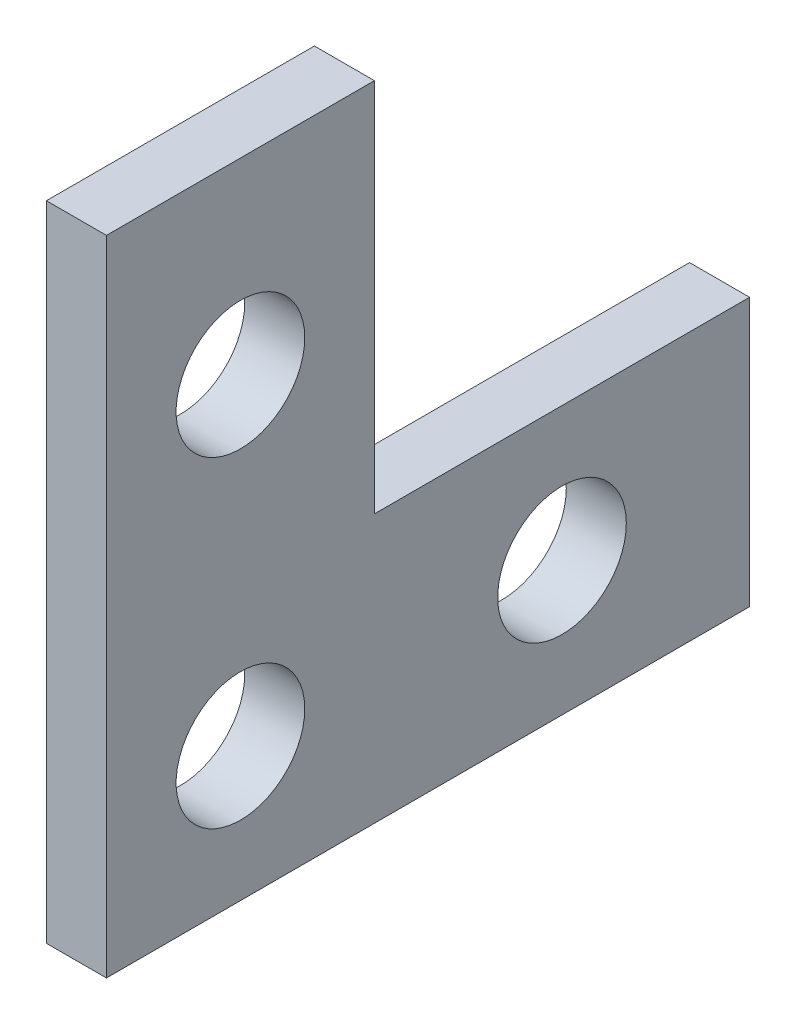
ISO-10303-21;
HEADER;
FILE_DESCRIPTION(('STEP AP214'),'2;1');
FILE_NAME('part.step','',(''),(''),'','','');
FILE_SCHEMA(('AUTOMOTIVE_DESIGN { 1 0 10303 214 1 1 1 1 }'));
ENDSEC;
DATA;
#1=APPLICATION_CONTEXT('core data for automotive mechanical design processes');
#2=APPLICATION_PROTOCOL_DEFINITION('international standard','automotive_design',2000,#1);
#3=PRODUCT_CONTEXT('',#1,'mechanical');
#4=PRODUCT('Part','Part','',(#3));
#5=PRODUCT_RELATED_PRODUCT_CATEGORY('part','',(#4));
#6=PRODUCT_DEFINITION_FORMATION('','',#4);
#7=PRODUCT_DEFINITION_CONTEXT('part definition',#1,'design');
#8=PRODUCT_DEFINITION('design','',#6,#7);
#9=PRODUCT_DEFINITION_SHAPE('','',#8);
#10=(LENGTH_UNIT() NAMED_UNIT(*) SI_UNIT(.MILLI.,.METRE.));
#11=(NAMED_UNIT(*) PLANE_ANGLE_UNIT() SI_UNIT($,.RADIAN.));
#12=(NAMED_UNIT(*) SI_UNIT($,.STERADIAN.) SOLID_ANGLE_UNIT());
#13=UNCERTAINTY_MEASURE_WITH_UNIT(LENGTH_MEASURE(1.E-05),#10,'distance_accuracy_value','');
#14=(GEOMETRIC_REPRESENTATION_CONTEXT(3) GLOBAL_UNCERTAINTY_ASSIGNED_CONTEXT((#13)) GLOBAL_UNIT_ASSIGNED_CONTEXT((#10,
#11,#12)) REPRESENTATION_CONTEXT('',''));
#15=CARTESIAN_POINT('',(0.,0.,0.));
#16=DIRECTION('',(0.,0.,1.));
#17=DIRECTION('',(1.,0.,0.));
#18=AXIS2_PLACEMENT_3D('',#15,#16,#17);
#19=CARTESIAN_POINT('',(0.7,-7.49999999999999,-7.50000000000001));
#20=DIRECTION('',(0.,0.,1.));
#21=DIRECTION('',(0.,-1.,0.));
#22=AXIS2_PLACEMENT_3D('',#19,#20,#21);
#23=PLANE('',#22);
#24=DIRECTION('',(0.,1.,0.));
#25=VECTOR('',#24,1.);
#26=CARTESIAN_POINT('',(-0.7,-7.49999999999999,-7.50000000000001));
#27=LINE('',#26,#25);
#28=CARTESIAN_POINT('',(-0.7,-7.49999999999999,-7.50000000000001));
#29=VERTEX_POINT('',#28);
#30=CARTESIAN_POINT('',(-0.7,-1.24999999999999,-7.5));
#31=VERTEX_POINT('',#30);
#32=EDGE_CURVE('E118',#29,#31,#27,.T.);
#33=ORIENTED_EDGE('',*,*,#32,.T.);
#34=DIRECTION('',(-1.,0.,0.));
#35=VECTOR('',#34,1.);
#36=CARTESIAN_POINT('',(0.7,-1.24999999999999,-7.5));
#37=LINE('',#36,#35);
#38=CARTESIAN_POINT('',(0.7,-1.24999999999999,-7.5));
#39=VERTEX_POINT('',#38);
#40=EDGE_CURVE('E11',#39,#31,#37,.T.);
#41=ORIENTED_EDGE('',*,*,#40,.F.);
#42=DIRECTION('',(0.,1.,0.));
#43=VECTOR('',#42,1.);
#44=CARTESIAN_POINT('',(0.7,-7.49999999999999,-7.50000000000001));
#45=LINE('',#44,#43);
#46=CARTESIAN_POINT('',(0.7,-7.49999999999999,-7.50000000000001));
#47=VERTEX_POINT('',#46);
#48=EDGE_CURVE('E129',#47,#39,#45,.T.);
#49=ORIENTED_EDGE('',*,*,#48,.F.);
#50=DIRECTION('',(-1.,0.,0.));
#51=VECTOR('',#50,1.);
#52=CARTESIAN_POINT('',(0.7,-7.49999999999999,-7.50000000000001));
#53=LINE('',#52,#51);
#54=EDGE_CURVE('E114',#47,#29,#53,.T.);
#55=ORIENTED_EDGE('',*,*,#54,.T.);
#56=EDGE_LOOP('',(#33,#41,#49,#55));
#57=FACE_BOUND('',#56,.T.);
#58=ADVANCED_FACE('F32',(#57),#23,.F.);
#59=CARTESIAN_POINT('',(0.7,-1.24999999999999,-7.5));
#60=DIRECTION('',(0.,-1.,0.));
#61=DIRECTION('',(0.,0.,-1.));
#62=AXIS2_PLACEMENT_3D('',#59,#60,#61);
#63=PLANE('',#62);
#64=DIRECTION('',(0.,0.,1.));
#65=VECTOR('',#64,1.);
#66=CARTESIAN_POINT('',(-0.7,-1.24999999999999,-7.5));
#67=LINE('',#66,#65);
#68=CARTESIAN_POINT('',(-0.7,-1.24999999999999,1.24999999999999));
#69=VERTEX_POINT('',#68);
#70=EDGE_CURVE('E121',#31,#69,#67,.T.);
#71=ORIENTED_EDGE('',*,*,#70,.T.);
#72=DIRECTION('',(-1.,0.,0.));
#73=VECTOR('',#72,1.);
#74=CARTESIAN_POINT('',(0.7,-1.24999999999999,1.24999999999999));
#75=LINE('',#74,#73);
#76=CARTESIAN_POINT('',(0.7,-1.24999999999999,1.24999999999999));
#77=VERTEX_POINT('',#76);
#78=EDGE_CURVE('E41',#77,#69,#75,.T.);
#79=ORIENTED_EDGE('',*,*,#78,.F.);
#80=DIRECTION('',(0.,0.,1.));
#81=VECTOR('',#80,1.);
#82=CARTESIAN_POINT('',(0.7,-1.24999999999999,-7.5));
#83=LINE('',#82,#81);
#84=EDGE_CURVE('E87',#39,#77,#83,.T.);
#85=ORIENTED_EDGE('',*,*,#84,.F.);
#86=ORIENTED_EDGE('',*,*,#40,.T.);
#87=EDGE_LOOP('',(#71,#79,#85,#86));
#88=FACE_BOUND('',#87,.T.);
#89=ADVANCED_FACE('F156',(#88),#63,.F.);
#90=CARTESIAN_POINT('',(0.7,7.5,1.24999999999999));
#91=DIRECTION('',(0.,0.,1.));
#92=DIRECTION('',(0.,-1.,0.));
#93=AXIS2_PLACEMENT_3D('',#90,#91,#92);
#94=PLANE('',#93);
#95=DIRECTION('',(0.,1.,0.));
#96=VECTOR('',#95,1.);
#97=CARTESIAN_POINT('',(-0.7,7.5,1.24999999999999));
#98=LINE('',#97,#96);
#99=CARTESIAN_POINT('',(-0.7,7.5,1.24999999999999));
#100=VERTEX_POINT('',#99);
#101=EDGE_CURVE('E124',#69,#100,#98,.T.);
#102=ORIENTED_EDGE('',*,*,#101,.T.);
#103=DIRECTION('',(-1.,0.,0.));
#104=VECTOR('',#103,1.);
#105=CARTESIAN_POINT('',(0.7,7.5,1.24999999999999));
#106=LINE('',#105,#104);
#107=CARTESIAN_POINT('',(0.7,7.5,1.24999999999999));
#108=VERTEX_POINT('',#107);
#109=EDGE_CURVE('E109',#108,#100,#106,.T.);
#110=ORIENTED_EDGE('',*,*,#109,.F.);
#111=DIRECTION('',(0.,1.,0.));
#112=VECTOR('',#111,1.);
#113=CARTESIAN_POINT('',(0.7,7.5,1.24999999999999));
#114=LINE('',#113,#112);
#115=EDGE_CURVE('E100',#77,#108,#114,.T.);
#116=ORIENTED_EDGE('',*,*,#115,.F.);
#117=ORIENTED_EDGE('',*,*,#78,.T.);
#118=EDGE_LOOP('',(#102,#110,#116,#117));
#119=FACE_BOUND('',#118,.T.);
#120=ADVANCED_FACE('F159',(#119),#94,.F.);
#121=CARTESIAN_POINT('',(0.7,7.5,7.49999999999999));
#122=DIRECTION('',(0.,-1.,0.));
#123=DIRECTION('',(0.,0.,-1.));
#124=AXIS2_PLACEMENT_3D('',#121,#122,#123);
#125=PLANE('',#124);
#126=DIRECTION('',(0.,0.,1.));
#127=VECTOR('',#126,1.);
#128=CARTESIAN_POINT('',(-0.7,7.5,7.49999999999999));
#129=LINE('',#128,#127);
#130=CARTESIAN_POINT('',(-0.7,7.5,7.49999999999999));
#131=VERTEX_POINT('',#130);
#132=EDGE_CURVE('E108',#100,#131,#129,.T.);
#133=ORIENTED_EDGE('',*,*,#132,.T.);
#134=DIRECTION('',(-1.,0.,0.));
#135=VECTOR('',#134,1.);
#136=CARTESIAN_POINT('',(0.7,7.5,7.49999999999999));
#137=LINE('',#136,#135);
#138=CARTESIAN_POINT('',(0.7,7.5,7.49999999999999));
#139=VERTEX_POINT('',#138);
#140=EDGE_CURVE('E105',#139,#131,#137,.T.);
#141=ORIENTED_EDGE('',*,*,#140,.F.);
#142=DIRECTION('',(0.,0.,1.));
#143=VECTOR('',#142,1.);
#144=CARTESIAN_POINT('',(0.7,7.5,7.49999999999999));
#145=LINE('',#144,#143);
#146=EDGE_CURVE('E94',#108,#139,#145,.T.);
#147=ORIENTED_EDGE('',*,*,#146,.F.);
#148=ORIENTED_EDGE('',*,*,#109,.T.);
#149=EDGE_LOOP('',(#133,#141,#147,#148));
#150=FACE_BOUND('',#149,.T.);
#151=ADVANCED_FACE('F106',(#150),#125,.F.);
#152=CARTESIAN_POINT('',(0.7,7.5,7.49999999999999));
#153=DIRECTION('',(0.,0.,-1.));
#154=DIRECTION('',(0.,1.,0.));
#155=AXIS2_PLACEMENT_3D('',#152,#153,#154);
#156=PLANE('',#155);
#157=DIRECTION('',(0.,-1.,0.));
#158=VECTOR('',#157,1.);
#159=CARTESIAN_POINT('',(-0.7,7.5,7.49999999999999));
#160=LINE('',#159,#158);
#161=CARTESIAN_POINT('',(-0.7,-7.5,7.5));
#162=VERTEX_POINT('',#161);
#163=EDGE_CURVE('E73',#131,#162,#160,.T.);
#164=ORIENTED_EDGE('',*,*,#163,.T.);
#165=DIRECTION('',(-1.,0.,0.));
#166=VECTOR('',#165,1.);
#167=CARTESIAN_POINT('',(0.7,-7.5,7.5));
#168=LINE('',#167,#166);
#169=CARTESIAN_POINT('',(0.7,-7.5,7.5));
#170=VERTEX_POINT('',#169);
#171=EDGE_CURVE('E110',#170,#162,#168,.T.);
#172=ORIENTED_EDGE('',*,*,#171,.F.);
#173=DIRECTION('',(0.,-1.,0.));
#174=VECTOR('',#173,1.);
#175=CARTESIAN_POINT('',(0.7,7.5,7.49999999999999));
#176=LINE('',#175,#174);
#177=EDGE_CURVE('E98',#139,#170,#176,.T.);
#178=ORIENTED_EDGE('',*,*,#177,.F.);
#179=ORIENTED_EDGE('',*,*,#140,.T.);
#180=EDGE_LOOP('',(#164,#172,#178,#179));
#181=FACE_BOUND('',#180,.T.);
#182=ADVANCED_FACE('F112',(#181),#156,.F.);
#183=CARTESIAN_POINT('',(0.7,-7.49999999999999,-7.50000000000001));
#184=DIRECTION('',(0.,1.,0.));
#185=DIRECTION('',(0.,0.,1.));
#186=AXIS2_PLACEMENT_3D('',#183,#184,#185);
#187=PLANE('',#186);
#188=DIRECTION('',(0.,0.,-1.));
#189=VECTOR('',#188,1.);
#190=CARTESIAN_POINT('',(-0.7,-7.49999999999999,-7.50000000000001));
#191=LINE('',#190,#189);
#192=EDGE_CURVE('E79',#162,#29,#191,.T.);
#193=ORIENTED_EDGE('',*,*,#192,.T.);
#194=ORIENTED_EDGE('',*,*,#54,.F.);
#195=DIRECTION('',(0.,0.,-1.));
#196=VECTOR('',#195,1.);
#197=CARTESIAN_POINT('',(0.7,-7.49999999999999,-7.50000000000001));
#198=LINE('',#197,#196);
#199=EDGE_CURVE('E50',#170,#47,#198,.T.);
#200=ORIENTED_EDGE('',*,*,#199,.F.);
#201=ORIENTED_EDGE('',*,*,#171,.T.);
#202=EDGE_LOOP('',(#193,#194,#200,#201));
#203=FACE_BOUND('',#202,.T.);
#204=ADVANCED_FACE('F164',(#203),#187,.F.);
#205=CARTESIAN_POINT('',(0.7,0.,0.));
#206=DIRECTION('',(1.,0.,0.));
#207=DIRECTION('',(0.,0.,-1.));
#208=AXIS2_PLACEMENT_3D('',#205,#206,#207);
#209=PLANE('',#208);
#210=CARTESIAN_POINT('',(0.699999999999999,-4.37499999999999,-3.125));
#211=DIRECTION('',(1.,0.,0.));
#212=DIRECTION('',(0.,0.,-1.));
#213=AXIS2_PLACEMENT_3D('',#210,#211,#212);
#214=CIRCLE('',#213,1.5);
#215=CARTESIAN_POINT('',(0.699999999999999,-4.37499999999999,-4.625));
#216=VERTEX_POINT('',#215);
#217=EDGE_CURVE('E140',#216,#216,#214,.T.);
#218=ORIENTED_EDGE('',*,*,#217,.F.);
#219=EDGE_LOOP('',(#218));
#220=FACE_BOUND('',#219,.T.);
#221=CARTESIAN_POINT('',(0.699999999999999,3.125,4.375));
#222=DIRECTION('',(1.,0.,0.));
#223=DIRECTION('',(0.,0.,-1.));
#224=AXIS2_PLACEMENT_3D('',#221,#222,#223);
#225=CIRCLE('',#224,1.5);
#226=CARTESIAN_POINT('',(0.699999999999999,3.125,2.875));
#227=VERTEX_POINT('',#226);
#228=EDGE_CURVE('E137',#227,#227,#225,.T.);
#229=ORIENTED_EDGE('',*,*,#228,.F.);
#230=EDGE_LOOP('',(#229));
#231=FACE_BOUND('',#230,.T.);
#232=CARTESIAN_POINT('',(0.699999999999999,-4.37499999999999,4.37499999999999));
#233=DIRECTION('',(1.,0.,0.));
#234=DIRECTION('',(0.,0.,-1.));
#235=AXIS2_PLACEMENT_3D('',#232,#233,#234);
#236=CIRCLE('',#235,1.5);
#237=CARTESIAN_POINT('',(0.699999999999999,-4.37499999999999,2.87499999999999));
#238=VERTEX_POINT('',#237);
#239=EDGE_CURVE('E122',#238,#238,#236,.T.);
#240=ORIENTED_EDGE('',*,*,#239,.F.);
#241=EDGE_LOOP('',(#240));
#242=FACE_BOUND('',#241,.T.);
#243=ORIENTED_EDGE('',*,*,#48,.T.);
#244=ORIENTED_EDGE('',*,*,#84,.T.);
#245=ORIENTED_EDGE('',*,*,#115,.T.);
#246=ORIENTED_EDGE('',*,*,#146,.T.);
#247=ORIENTED_EDGE('',*,*,#177,.T.);
#248=ORIENTED_EDGE('',*,*,#199,.T.);
#249=EDGE_LOOP('',(#243,#244,#245,#246,#247,#248));
#250=FACE_BOUND('',#249,.T.);
#251=ADVANCED_FACE('F96',(#220,#231,#242,#250),#209,.T.);
#252=CARTESIAN_POINT('',(-0.7,0.,0.));
#253=DIRECTION('',(1.,0.,0.));
#254=DIRECTION('',(0.,0.,-1.));
#255=AXIS2_PLACEMENT_3D('',#252,#253,#254);
#256=PLANE('',#255);
#257=CARTESIAN_POINT('',(-0.699999999999999,-4.37499999999999,-3.125));
#258=DIRECTION('',(1.,0.,0.));
#259=DIRECTION('',(0.,0.,-1.));
#260=AXIS2_PLACEMENT_3D('',#257,#258,#259);
#261=CIRCLE('',#260,1.5);
#262=CARTESIAN_POINT('',(-0.699999999999999,-4.37499999999999,-4.625));
#263=VERTEX_POINT('',#262);
#264=EDGE_CURVE('E35',#263,#263,#261,.T.);
#265=ORIENTED_EDGE('',*,*,#264,.T.);
#266=EDGE_LOOP('',(#265));
#267=FACE_BOUND('',#266,.T.);
#268=CARTESIAN_POINT('',(-0.699999999999999,3.125,4.375));
#269=DIRECTION('',(1.,0.,0.));
#270=DIRECTION('',(0.,0.,-1.));
#271=AXIS2_PLACEMENT_3D('',#268,#269,#270);
#272=CIRCLE('',#271,1.5);
#273=CARTESIAN_POINT('',(-0.699999999999999,3.125,2.875));
#274=VERTEX_POINT('',#273);
#275=EDGE_CURVE('E138',#274,#274,#272,.T.);
#276=ORIENTED_EDGE('',*,*,#275,.T.);
#277=EDGE_LOOP('',(#276));
#278=FACE_BOUND('',#277,.T.);
#279=CARTESIAN_POINT('',(-0.699999999999999,-4.37499999999999,4.37499999999999));
#280=DIRECTION('',(1.,0.,0.));
#281=DIRECTION('',(0.,0.,-1.));
#282=AXIS2_PLACEMENT_3D('',#279,#280,#281);
#283=CIRCLE('',#282,1.5);
#284=CARTESIAN_POINT('',(-0.699999999999999,-4.37499999999999,2.87499999999999));
#285=VERTEX_POINT('',#284);
#286=EDGE_CURVE('E135',#285,#285,#283,.T.);
#287=ORIENTED_EDGE('',*,*,#286,.T.);
#288=EDGE_LOOP('',(#287));
#289=FACE_BOUND('',#288,.T.);
#290=ORIENTED_EDGE('',*,*,#32,.F.);
#291=ORIENTED_EDGE('',*,*,#192,.F.);
#292=ORIENTED_EDGE('',*,*,#163,.F.);
#293=ORIENTED_EDGE('',*,*,#132,.F.);
#294=ORIENTED_EDGE('',*,*,#101,.F.);
#295=ORIENTED_EDGE('',*,*,#70,.F.);
#296=EDGE_LOOP('',(#290,#291,#292,#293,#294,#295));
#297=FACE_BOUND('',#296,.T.);
#298=ADVANCED_FACE('F162',(#267,#278,#289,#297),#256,.F.);
#299=CARTESIAN_POINT('',(-9.3,-4.37499999999999,4.37499999999999));
#300=DIRECTION('',(1.,0.,0.));
#301=DIRECTION('',(0.,0.,-1.));
#302=AXIS2_PLACEMENT_3D('',#299,#300,#301);
#303=CYLINDRICAL_SURFACE('',#302,1.5);
#304=ORIENTED_EDGE('',*,*,#239,.T.);
#305=EDGE_LOOP('',(#304));
#306=FACE_BOUND('',#305,.T.);
#307=ORIENTED_EDGE('',*,*,#286,.F.);
#308=EDGE_LOOP('',(#307));
#309=FACE_BOUND('',#308,.T.);
#310=ADVANCED_FACE('F209',(#306,#309),#303,.F.);
#311=CARTESIAN_POINT('',(-9.3,3.125,4.375));
#312=DIRECTION('',(1.,0.,0.));
#313=DIRECTION('',(0.,0.,-1.));
#314=AXIS2_PLACEMENT_3D('',#311,#312,#313);
#315=CYLINDRICAL_SURFACE('',#314,1.5);
#316=ORIENTED_EDGE('',*,*,#228,.T.);
#317=EDGE_LOOP('',(#316));
#318=FACE_BOUND('',#317,.T.);
#319=ORIENTED_EDGE('',*,*,#275,.F.);
#320=EDGE_LOOP('',(#319));
#321=FACE_BOUND('',#320,.T.);
#322=ADVANCED_FACE('F217',(#318,#321),#315,.F.);
#323=CARTESIAN_POINT('',(-9.3,-4.37499999999999,-3.125));
#324=DIRECTION('',(1.,0.,0.));
#325=DIRECTION('',(0.,0.,-1.));
#326=AXIS2_PLACEMENT_3D('',#323,#324,#325);
#327=CYLINDRICAL_SURFACE('',#326,1.5);
#328=ORIENTED_EDGE('',*,*,#217,.T.);
#329=EDGE_LOOP('',(#328));
#330=FACE_BOUND('',#329,.T.);
#331=ORIENTED_EDGE('',*,*,#264,.F.);
#332=EDGE_LOOP('',(#331));
#333=FACE_BOUND('',#332,.T.);
#334=ADVANCED_FACE('F227',(#330,#333),#327,.F.);
#335=CLOSED_SHELL('',(#58,#89,#120,#151,#182,#204,#251,#298,#310,#322,#334));
#336=MANIFOLD_SOLID_BREP('B2',#335);
#337=ADVANCED_BREP_SHAPE_REPRESENTATION('',(#18,#336),#14);
#338=SHAPE_DEFINITION_REPRESENTATION(#9,#337);
ENDSEC;
END-ISO-10303-21;
